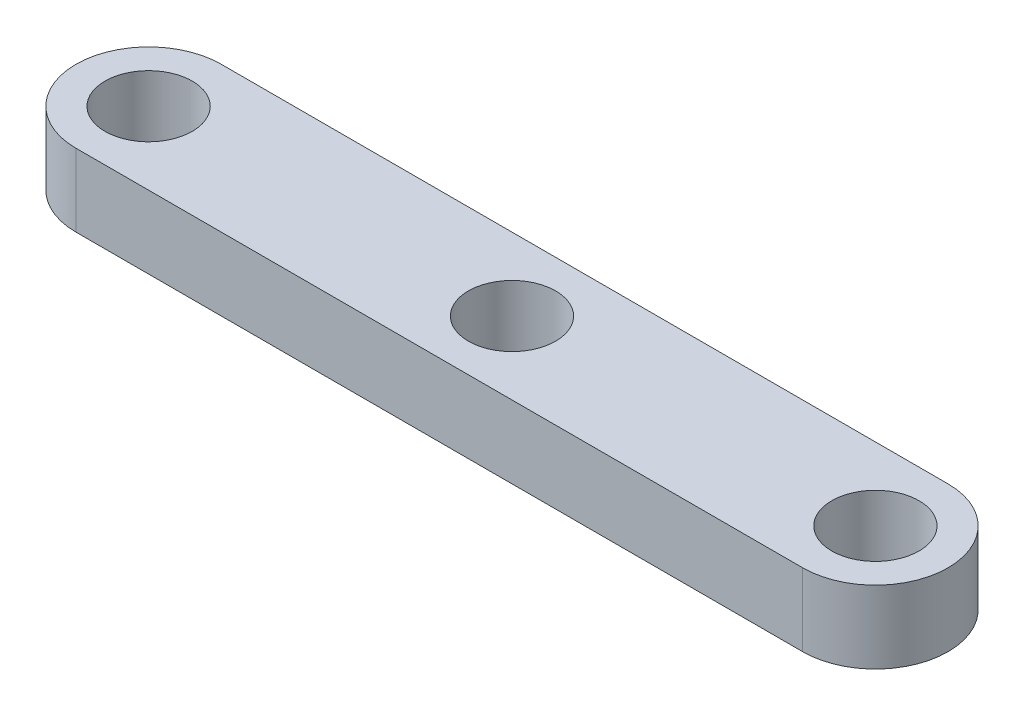
ISO-10303-21;
HEADER;
FILE_DESCRIPTION(('STEP AP214'),'2;1');
FILE_NAME('part.step','',(''),(''),'','','');
FILE_SCHEMA(('AUTOMOTIVE_DESIGN { 1 0 10303 214 1 1 1 1 }'));
ENDSEC;
DATA;
#1=APPLICATION_CONTEXT('core data for automotive mechanical design processes');
#2=APPLICATION_PROTOCOL_DEFINITION('international standard','automotive_design',2000,#1);
#3=PRODUCT_CONTEXT('',#1,'mechanical');
#4=PRODUCT('Part','Part','',(#3));
#5=PRODUCT_RELATED_PRODUCT_CATEGORY('part','',(#4));
#6=PRODUCT_DEFINITION_FORMATION('','',#4);
#7=PRODUCT_DEFINITION_CONTEXT('part definition',#1,'design');
#8=PRODUCT_DEFINITION('design','',#6,#7);
#9=PRODUCT_DEFINITION_SHAPE('','',#8);
#10=(LENGTH_UNIT() NAMED_UNIT(*) SI_UNIT(.MILLI.,.METRE.));
#11=(NAMED_UNIT(*) PLANE_ANGLE_UNIT() SI_UNIT($,.RADIAN.));
#12=(NAMED_UNIT(*) SI_UNIT($,.STERADIAN.) SOLID_ANGLE_UNIT());
#13=UNCERTAINTY_MEASURE_WITH_UNIT(LENGTH_MEASURE(1.E-05),#10,'distance_accuracy_value','');
#14=(GEOMETRIC_REPRESENTATION_CONTEXT(3) GLOBAL_UNCERTAINTY_ASSIGNED_CONTEXT((#13)) GLOBAL_UNIT_ASSIGNED_CONTEXT((#10,
#11,#12)) REPRESENTATION_CONTEXT('',''));
#15=CARTESIAN_POINT('',(0.,0.,0.));
#16=DIRECTION('',(0.,0.,1.));
#17=DIRECTION('',(1.,0.,0.));
#18=AXIS2_PLACEMENT_3D('',#15,#16,#17);
#19=CARTESIAN_POINT('',(-12.7,2.54,0.));
#20=DIRECTION('',(0.,1.,0.));
#21=DIRECTION('',(0.,0.,1.));
#22=AXIS2_PLACEMENT_3D('',#19,#20,#21);
#23=PLANE('',#22);
#24=CARTESIAN_POINT('',(-12.7,2.54,0.));
#25=DIRECTION('',(0.,1.,0.));
#26=DIRECTION('',(0.,0.,1.));
#27=AXIS2_PLACEMENT_3D('',#24,#25,#26);
#28=CIRCLE('',#27,1.524);
#29=CARTESIAN_POINT('',(-12.7,2.54,1.524));
#30=VERTEX_POINT('',#29);
#31=EDGE_CURVE('E121',#30,#30,#28,.T.);
#32=ORIENTED_EDGE('',*,*,#31,.F.);
#33=EDGE_LOOP('',(#32));
#34=FACE_BOUND('',#33,.T.);
#35=CARTESIAN_POINT('',(-12.7,2.54,0.));
#36=DIRECTION('',(0.,1.,0.));
#37=DIRECTION('',(0.,0.,1.));
#38=AXIS2_PLACEMENT_3D('',#35,#36,#37);
#39=CIRCLE('',#38,2.54);
#40=CARTESIAN_POINT('',(-12.7,2.54,-2.54));
#41=VERTEX_POINT('',#40);
#42=CARTESIAN_POINT('',(-12.7,2.54,2.54));
#43=VERTEX_POINT('',#42);
#44=EDGE_CURVE('E93',#41,#43,#39,.T.);
#45=ORIENTED_EDGE('',*,*,#44,.T.);
#46=DIRECTION('',(1.,0.,0.));
#47=VECTOR('',#46,1.);
#48=CARTESIAN_POINT('',(-12.7,2.54,2.54));
#49=LINE('',#48,#47);
#50=CARTESIAN_POINT('',(12.7,2.54,2.54));
#51=VERTEX_POINT('',#50);
#52=EDGE_CURVE('E88',#43,#51,#49,.T.);
#53=ORIENTED_EDGE('',*,*,#52,.T.);
#54=CARTESIAN_POINT('',(12.7,2.54,0.));
#55=DIRECTION('',(0.,1.,0.));
#56=DIRECTION('',(0.,0.,1.));
#57=AXIS2_PLACEMENT_3D('',#54,#55,#56);
#58=CIRCLE('',#57,2.54);
#59=CARTESIAN_POINT('',(12.7,2.54,-2.54));
#60=VERTEX_POINT('',#59);
#61=EDGE_CURVE('E91',#51,#60,#58,.T.);
#62=ORIENTED_EDGE('',*,*,#61,.T.);
#63=DIRECTION('',(-1.,0.,0.));
#64=VECTOR('',#63,1.);
#65=CARTESIAN_POINT('',(-12.7,2.54,-2.54));
#66=LINE('',#65,#64);
#67=EDGE_CURVE('E59',#60,#41,#66,.T.);
#68=ORIENTED_EDGE('',*,*,#67,.T.);
#69=EDGE_LOOP('',(#45,#53,#62,#68));
#70=FACE_BOUND('',#69,.T.);
#71=CARTESIAN_POINT('',(0.,2.54,0.));
#72=DIRECTION('',(0.,1.,0.));
#73=DIRECTION('',(0.,0.,1.));
#74=AXIS2_PLACEMENT_3D('',#71,#72,#73);
#75=CIRCLE('',#74,1.524);
#76=CARTESIAN_POINT('',(0.,2.54,1.524));
#77=VERTEX_POINT('',#76);
#78=EDGE_CURVE('E109',#77,#77,#75,.T.);
#79=ORIENTED_EDGE('',*,*,#78,.F.);
#80=EDGE_LOOP('',(#79));
#81=FACE_BOUND('',#80,.T.);
#82=CARTESIAN_POINT('',(12.7,2.54,0.));
#83=DIRECTION('',(0.,1.,0.));
#84=DIRECTION('',(0.,0.,1.));
#85=AXIS2_PLACEMENT_3D('',#82,#83,#84);
#86=CIRCLE('',#85,1.524);
#87=CARTESIAN_POINT('',(12.7,2.54,1.524));
#88=VERTEX_POINT('',#87);
#89=EDGE_CURVE('E129',#88,#88,#86,.T.);
#90=ORIENTED_EDGE('',*,*,#89,.F.);
#91=EDGE_LOOP('',(#90));
#92=FACE_BOUND('',#91,.T.);
#93=ADVANCED_FACE('F41',(#34,#70,#81,#92),#23,.T.);
#94=CARTESIAN_POINT('',(-12.7,0.,0.));
#95=DIRECTION('',(0.,1.,0.));
#96=DIRECTION('',(0.,0.,1.));
#97=AXIS2_PLACEMENT_3D('',#94,#95,#96);
#98=PLANE('',#97);
#99=CARTESIAN_POINT('',(-12.7,0.,0.));
#100=DIRECTION('',(0.,1.,0.));
#101=DIRECTION('',(0.,0.,1.));
#102=AXIS2_PLACEMENT_3D('',#99,#100,#101);
#103=CIRCLE('',#102,2.54);
#104=CARTESIAN_POINT('',(-12.7,0.,-2.54));
#105=VERTEX_POINT('',#104);
#106=CARTESIAN_POINT('',(-12.7,0.,2.54));
#107=VERTEX_POINT('',#106);
#108=EDGE_CURVE('E103',#105,#107,#103,.T.);
#109=ORIENTED_EDGE('',*,*,#108,.F.);
#110=DIRECTION('',(-1.,0.,0.));
#111=VECTOR('',#110,1.);
#112=CARTESIAN_POINT('',(-12.7,0.,-2.54));
#113=LINE('',#112,#111);
#114=CARTESIAN_POINT('',(12.7,0.,-2.54));
#115=VERTEX_POINT('',#114);
#116=EDGE_CURVE('E83',#115,#105,#113,.T.);
#117=ORIENTED_EDGE('',*,*,#116,.F.);
#118=CARTESIAN_POINT('',(12.7,0.,0.));
#119=DIRECTION('',(0.,1.,0.));
#120=DIRECTION('',(0.,0.,1.));
#121=AXIS2_PLACEMENT_3D('',#118,#119,#120);
#122=CIRCLE('',#121,2.54);
#123=CARTESIAN_POINT('',(12.7,0.,2.54));
#124=VERTEX_POINT('',#123);
#125=EDGE_CURVE('E75',#124,#115,#122,.T.);
#126=ORIENTED_EDGE('',*,*,#125,.F.);
#127=DIRECTION('',(1.,0.,0.));
#128=VECTOR('',#127,1.);
#129=CARTESIAN_POINT('',(-12.7,0.,2.54));
#130=LINE('',#129,#128);
#131=EDGE_CURVE('E100',#107,#124,#130,.T.);
#132=ORIENTED_EDGE('',*,*,#131,.F.);
#133=EDGE_LOOP('',(#109,#117,#126,#132));
#134=FACE_BOUND('',#133,.T.);
#135=CARTESIAN_POINT('',(0.,0.,0.));
#136=DIRECTION('',(0.,1.,0.));
#137=DIRECTION('',(0.,0.,1.));
#138=AXIS2_PLACEMENT_3D('',#135,#136,#137);
#139=CIRCLE('',#138,1.524);
#140=CARTESIAN_POINT('',(0.,0.,1.524));
#141=VERTEX_POINT('',#140);
#142=EDGE_CURVE('E120',#141,#141,#139,.T.);
#143=ORIENTED_EDGE('',*,*,#142,.T.);
#144=EDGE_LOOP('',(#143));
#145=FACE_BOUND('',#144,.T.);
#146=CARTESIAN_POINT('',(-12.7,0.,0.));
#147=DIRECTION('',(0.,1.,0.));
#148=DIRECTION('',(0.,0.,1.));
#149=AXIS2_PLACEMENT_3D('',#146,#147,#148);
#150=CIRCLE('',#149,1.524);
#151=CARTESIAN_POINT('',(-12.7,0.,1.524));
#152=VERTEX_POINT('',#151);
#153=EDGE_CURVE('E128',#152,#152,#150,.T.);
#154=ORIENTED_EDGE('',*,*,#153,.T.);
#155=EDGE_LOOP('',(#154));
#156=FACE_BOUND('',#155,.T.);
#157=CARTESIAN_POINT('',(12.7,0.,0.));
#158=DIRECTION('',(0.,1.,0.));
#159=DIRECTION('',(0.,0.,1.));
#160=AXIS2_PLACEMENT_3D('',#157,#158,#159);
#161=CIRCLE('',#160,1.524);
#162=CARTESIAN_POINT('',(12.7,0.,1.524));
#163=VERTEX_POINT('',#162);
#164=EDGE_CURVE('E135',#163,#163,#161,.T.);
#165=ORIENTED_EDGE('',*,*,#164,.T.);
#166=EDGE_LOOP('',(#165));
#167=FACE_BOUND('',#166,.T.);
#168=ADVANCED_FACE('F116',(#134,#145,#156,#167),#98,.F.);
#169=CARTESIAN_POINT('',(-12.7,2.54,0.));
#170=DIRECTION('',(0.,-1.,0.));
#171=DIRECTION('',(0.,0.,-1.));
#172=AXIS2_PLACEMENT_3D('',#169,#170,#171);
#173=CYLINDRICAL_SURFACE('',#172,2.54);
#174=ORIENTED_EDGE('',*,*,#108,.T.);
#175=DIRECTION('',(0.,-1.,0.));
#176=VECTOR('',#175,1.);
#177=CARTESIAN_POINT('',(-12.7,2.54,2.54));
#178=LINE('',#177,#176);
#179=EDGE_CURVE('E11',#43,#107,#178,.T.);
#180=ORIENTED_EDGE('',*,*,#179,.F.);
#181=ORIENTED_EDGE('',*,*,#44,.F.);
#182=DIRECTION('',(0.,-1.,0.));
#183=VECTOR('',#182,1.);
#184=CARTESIAN_POINT('',(-12.7,2.54,-2.54));
#185=LINE('',#184,#183);
#186=EDGE_CURVE('E102',#41,#105,#185,.T.);
#187=ORIENTED_EDGE('',*,*,#186,.T.);
#188=EDGE_LOOP('',(#174,#180,#181,#187));
#189=FACE_BOUND('',#188,.T.);
#190=ADVANCED_FACE('F43',(#189),#173,.T.);
#191=CARTESIAN_POINT('',(-12.7,2.54,2.54));
#192=DIRECTION('',(0.,0.,-1.));
#193=DIRECTION('',(-1.,0.,0.));
#194=AXIS2_PLACEMENT_3D('',#191,#192,#193);
#195=PLANE('',#194);
#196=ORIENTED_EDGE('',*,*,#131,.T.);
#197=DIRECTION('',(0.,-1.,0.));
#198=VECTOR('',#197,1.);
#199=CARTESIAN_POINT('',(12.7,2.54,2.54));
#200=LINE('',#199,#198);
#201=EDGE_CURVE('E49',#51,#124,#200,.T.);
#202=ORIENTED_EDGE('',*,*,#201,.F.);
#203=ORIENTED_EDGE('',*,*,#52,.F.);
#204=ORIENTED_EDGE('',*,*,#179,.T.);
#205=EDGE_LOOP('',(#196,#202,#203,#204));
#206=FACE_BOUND('',#205,.T.);
#207=ADVANCED_FACE('F96',(#206),#195,.F.);
#208=CARTESIAN_POINT('',(12.7,2.54,0.));
#209=DIRECTION('',(0.,-1.,0.));
#210=DIRECTION('',(0.,0.,-1.));
#211=AXIS2_PLACEMENT_3D('',#208,#209,#210);
#212=CYLINDRICAL_SURFACE('',#211,2.54);
#213=ORIENTED_EDGE('',*,*,#125,.T.);
#214=DIRECTION('',(0.,-1.,0.));
#215=VECTOR('',#214,1.);
#216=CARTESIAN_POINT('',(12.7,2.54,-2.54));
#217=LINE('',#216,#215);
#218=EDGE_CURVE('E97',#60,#115,#217,.T.);
#219=ORIENTED_EDGE('',*,*,#218,.F.);
#220=ORIENTED_EDGE('',*,*,#61,.F.);
#221=ORIENTED_EDGE('',*,*,#201,.T.);
#222=EDGE_LOOP('',(#213,#219,#220,#221));
#223=FACE_BOUND('',#222,.T.);
#224=ADVANCED_FACE('F98',(#223),#212,.T.);
#225=CARTESIAN_POINT('',(-12.7,2.54,-2.54));
#226=DIRECTION('',(0.,0.,1.));
#227=DIRECTION('',(1.,0.,0.));
#228=AXIS2_PLACEMENT_3D('',#225,#226,#227);
#229=PLANE('',#228);
#230=ORIENTED_EDGE('',*,*,#116,.T.);
#231=ORIENTED_EDGE('',*,*,#186,.F.);
#232=ORIENTED_EDGE('',*,*,#67,.F.);
#233=ORIENTED_EDGE('',*,*,#218,.T.);
#234=EDGE_LOOP('',(#230,#231,#232,#233));
#235=FACE_BOUND('',#234,.T.);
#236=ADVANCED_FACE('F111',(#235),#229,.F.);
#237=CARTESIAN_POINT('',(0.,2.54,0.));
#238=DIRECTION('',(0.,-1.,0.));
#239=DIRECTION('',(0.,0.,-1.));
#240=AXIS2_PLACEMENT_3D('',#237,#238,#239);
#241=CYLINDRICAL_SURFACE('',#240,1.524);
#242=ORIENTED_EDGE('',*,*,#78,.T.);
#243=EDGE_LOOP('',(#242));
#244=FACE_BOUND('',#243,.T.);
#245=ORIENTED_EDGE('',*,*,#142,.F.);
#246=EDGE_LOOP('',(#245));
#247=FACE_BOUND('',#246,.T.);
#248=ADVANCED_FACE('F148',(#244,#247),#241,.F.);
#249=CARTESIAN_POINT('',(-12.7,2.54,0.));
#250=DIRECTION('',(0.,-1.,0.));
#251=DIRECTION('',(0.,0.,-1.));
#252=AXIS2_PLACEMENT_3D('',#249,#250,#251);
#253=CYLINDRICAL_SURFACE('',#252,1.524);
#254=ORIENTED_EDGE('',*,*,#31,.T.);
#255=EDGE_LOOP('',(#254));
#256=FACE_BOUND('',#255,.T.);
#257=ORIENTED_EDGE('',*,*,#153,.F.);
#258=EDGE_LOOP('',(#257));
#259=FACE_BOUND('',#258,.T.);
#260=ADVANCED_FACE('F193',(#256,#259),#253,.F.);
#261=CARTESIAN_POINT('',(12.7,2.54,0.));
#262=DIRECTION('',(0.,-1.,0.));
#263=DIRECTION('',(0.,0.,-1.));
#264=AXIS2_PLACEMENT_3D('',#261,#262,#263);
#265=CYLINDRICAL_SURFACE('',#264,1.524);
#266=ORIENTED_EDGE('',*,*,#89,.T.);
#267=EDGE_LOOP('',(#266));
#268=FACE_BOUND('',#267,.T.);
#269=ORIENTED_EDGE('',*,*,#164,.F.);
#270=EDGE_LOOP('',(#269));
#271=FACE_BOUND('',#270,.T.);
#272=ADVANCED_FACE('F138',(#268,#271),#265,.F.);
#273=CLOSED_SHELL('',(#93,#168,#190,#207,#224,#236,#248,#260,#272));
#274=MANIFOLD_SOLID_BREP('B2',#273);
#275=ADVANCED_BREP_SHAPE_REPRESENTATION('',(#18,#274),#14);
#276=SHAPE_DEFINITION_REPRESENTATION(#9,#275);
ENDSEC;
END-ISO-10303-21;
